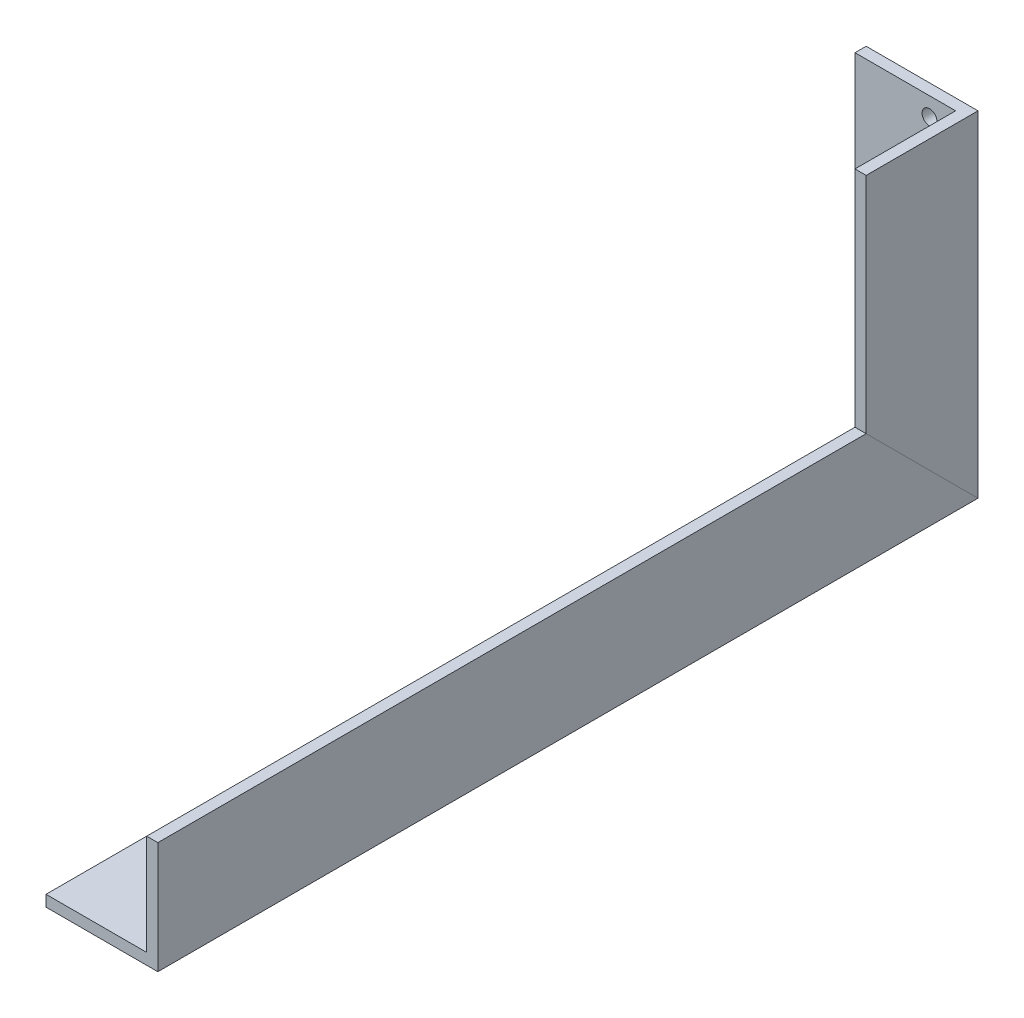
ISO-10303-21;
HEADER;
FILE_DESCRIPTION(('STEP AP214'),'2;1');
FILE_NAME('part.step','',(''),(''),'','','');
FILE_SCHEMA(('AUTOMOTIVE_DESIGN { 1 0 10303 214 1 1 1 1 }'));
ENDSEC;
DATA;
#1=APPLICATION_CONTEXT('core data for automotive mechanical design processes');
#2=APPLICATION_PROTOCOL_DEFINITION('international standard','automotive_design',2000,#1);
#3=PRODUCT_CONTEXT('',#1,'mechanical');
#4=PRODUCT('Part','Part','',(#3));
#5=PRODUCT_RELATED_PRODUCT_CATEGORY('part','',(#4));
#6=PRODUCT_DEFINITION_FORMATION('','',#4);
#7=PRODUCT_DEFINITION_CONTEXT('part definition',#1,'design');
#8=PRODUCT_DEFINITION('design','',#6,#7);
#9=PRODUCT_DEFINITION_SHAPE('','',#8);
#10=(LENGTH_UNIT() NAMED_UNIT(*) SI_UNIT(.MILLI.,.METRE.));
#11=(NAMED_UNIT(*) PLANE_ANGLE_UNIT() SI_UNIT($,.RADIAN.));
#12=(NAMED_UNIT(*) SI_UNIT($,.STERADIAN.) SOLID_ANGLE_UNIT());
#13=UNCERTAINTY_MEASURE_WITH_UNIT(LENGTH_MEASURE(1.E-05),#10,'distance_accuracy_value','');
#14=(GEOMETRIC_REPRESENTATION_CONTEXT(3) GLOBAL_UNCERTAINTY_ASSIGNED_CONTEXT((#13)) GLOBAL_UNIT_ASSIGNED_CONTEXT((#10,
#11,#12)) REPRESENTATION_CONTEXT('',''));
#15=CARTESIAN_POINT('',(0.,0.,0.));
#16=DIRECTION('',(0.,0.,1.));
#17=DIRECTION('',(1.,0.,0.));
#18=AXIS2_PLACEMENT_3D('',#15,#16,#17);
#19=CARTESIAN_POINT('',(0.,90.,-220.));
#20=DIRECTION('',(0.,-1.,0.));
#21=DIRECTION('',(1.,0.,0.));
#22=AXIS2_PLACEMENT_3D('',#19,#20,#21);
#23=PLANE('',#22);
#24=DIRECTION('',(0.,0.,-1.));
#25=VECTOR('',#24,1.);
#26=CARTESIAN_POINT('',(0.,90.,-217.));
#27=LINE('',#26,#25);
#28=CARTESIAN_POINT('',(0.,90.,-217.));
#29=VERTEX_POINT('',#28);
#30=CARTESIAN_POINT('',(0.,90.,-220.));
#31=VERTEX_POINT('',#30);
#32=EDGE_CURVE('E79',#29,#31,#27,.T.);
#33=ORIENTED_EDGE('',*,*,#32,.F.);
#34=DIRECTION('',(-1.,0.,0.));
#35=VECTOR('',#34,1.);
#36=CARTESIAN_POINT('',(27.,90.,-217.));
#37=LINE('',#36,#35);
#38=CARTESIAN_POINT('',(27.,90.,-217.));
#39=VERTEX_POINT('',#38);
#40=EDGE_CURVE('E87',#39,#29,#37,.T.);
#41=ORIENTED_EDGE('',*,*,#40,.F.);
#42=DIRECTION('',(0.,0.,-1.));
#43=VECTOR('',#42,1.);
#44=CARTESIAN_POINT('',(27.,90.,-190.));
#45=LINE('',#44,#43);
#46=CARTESIAN_POINT('',(27.,90.,-190.));
#47=VERTEX_POINT('',#46);
#48=EDGE_CURVE('E188',#47,#39,#45,.T.);
#49=ORIENTED_EDGE('',*,*,#48,.F.);
#50=DIRECTION('',(-1.,0.,0.));
#51=VECTOR('',#50,1.);
#52=CARTESIAN_POINT('',(30.,90.,-190.));
#53=LINE('',#52,#51);
#54=CARTESIAN_POINT('',(30.,90.,-190.));
#55=VERTEX_POINT('',#54);
#56=EDGE_CURVE('E192',#55,#47,#53,.T.);
#57=ORIENTED_EDGE('',*,*,#56,.F.);
#58=DIRECTION('',(0.,0.,1.));
#59=VECTOR('',#58,1.);
#60=CARTESIAN_POINT('',(30.,90.,-220.));
#61=LINE('',#60,#59);
#62=CARTESIAN_POINT('',(30.,90.,-220.));
#63=VERTEX_POINT('',#62);
#64=EDGE_CURVE('E196',#63,#55,#61,.T.);
#65=ORIENTED_EDGE('',*,*,#64,.F.);
#66=DIRECTION('',(1.,0.,0.));
#67=VECTOR('',#66,1.);
#68=CARTESIAN_POINT('',(0.,90.,-220.));
#69=LINE('',#68,#67);
#70=EDGE_CURVE('E203',#31,#63,#69,.T.);
#71=ORIENTED_EDGE('',*,*,#70,.F.);
#72=EDGE_LOOP('',(#33,#41,#49,#57,#65,#71));
#73=FACE_BOUND('',#72,.T.);
#74=ADVANCED_FACE('F38',(#73),#23,.F.);
#75=CARTESIAN_POINT('',(0.,0.,0.));
#76=DIRECTION('',(0.,0.,1.));
#77=DIRECTION('',(1.,0.,0.));
#78=AXIS2_PLACEMENT_3D('',#75,#76,#77);
#79=PLANE('',#78);
#80=DIRECTION('',(0.,-1.,0.));
#81=VECTOR('',#80,1.);
#82=CARTESIAN_POINT('',(0.,3.,0.));
#83=LINE('',#82,#81);
#84=CARTESIAN_POINT('',(0.,3.,0.));
#85=VERTEX_POINT('',#84);
#86=CARTESIAN_POINT('',(0.,0.,0.));
#87=VERTEX_POINT('',#86);
#88=EDGE_CURVE('E11',#85,#87,#83,.T.);
#89=ORIENTED_EDGE('',*,*,#88,.T.);
#90=DIRECTION('',(1.,0.,0.));
#91=VECTOR('',#90,1.);
#92=CARTESIAN_POINT('',(0.,0.,0.));
#93=LINE('',#92,#91);
#94=CARTESIAN_POINT('',(30.,0.,0.));
#95=VERTEX_POINT('',#94);
#96=EDGE_CURVE('E48',#87,#95,#93,.T.);
#97=ORIENTED_EDGE('',*,*,#96,.T.);
#98=DIRECTION('',(0.,1.,0.));
#99=VECTOR('',#98,1.);
#100=CARTESIAN_POINT('',(30.,0.,0.));
#101=LINE('',#100,#99);
#102=CARTESIAN_POINT('',(30.,30.,0.));
#103=VERTEX_POINT('',#102);
#104=EDGE_CURVE('E122',#95,#103,#101,.T.);
#105=ORIENTED_EDGE('',*,*,#104,.T.);
#106=DIRECTION('',(-1.,0.,0.));
#107=VECTOR('',#106,1.);
#108=CARTESIAN_POINT('',(30.,30.,0.));
#109=LINE('',#108,#107);
#110=CARTESIAN_POINT('',(27.,30.,0.));
#111=VERTEX_POINT('',#110);
#112=EDGE_CURVE('E132',#103,#111,#109,.T.);
#113=ORIENTED_EDGE('',*,*,#112,.T.);
#114=DIRECTION('',(0.,-1.,0.));
#115=VECTOR('',#114,1.);
#116=CARTESIAN_POINT('',(27.,30.,0.));
#117=LINE('',#116,#115);
#118=CARTESIAN_POINT('',(27.,3.,0.));
#119=VERTEX_POINT('',#118);
#120=EDGE_CURVE('E230',#111,#119,#117,.T.);
#121=ORIENTED_EDGE('',*,*,#120,.T.);
#122=DIRECTION('',(-1.,0.,0.));
#123=VECTOR('',#122,1.);
#124=CARTESIAN_POINT('',(27.,3.,0.));
#125=LINE('',#124,#123);
#126=EDGE_CURVE('E184',#119,#85,#125,.T.);
#127=ORIENTED_EDGE('',*,*,#126,.T.);
#128=EDGE_LOOP('',(#89,#97,#105,#113,#121,#127));
#129=FACE_BOUND('',#128,.T.);
#130=ADVANCED_FACE('F134',(#129),#79,.T.);
#131=CARTESIAN_POINT('',(0.,0.,-217.));
#132=DIRECTION('',(1.,0.,0.));
#133=DIRECTION('',(0.,0.,-1.));
#134=AXIS2_PLACEMENT_3D('',#131,#132,#133);
#135=PLANE('',#134);
#136=DIRECTION('',(0.,0.707106781186548,0.707106781186548));
#137=VECTOR('',#136,1.);
#138=CARTESIAN_POINT('',(0.,111.5,-108.5));
#139=LINE('',#138,#137);
#140=CARTESIAN_POINT('',(0.,0.,-220.));
#141=VERTEX_POINT('',#140);
#142=CARTESIAN_POINT('',(0.,3.00000000000001,-217.));
#143=VERTEX_POINT('',#142);
#144=EDGE_CURVE('E160',#141,#143,#139,.T.);
#145=ORIENTED_EDGE('',*,*,#144,.T.);
#146=DIRECTION('',(0.,1.,0.));
#147=VECTOR('',#146,1.);
#148=CARTESIAN_POINT('',(0.,0.,-217.));
#149=LINE('',#148,#147);
#150=EDGE_CURVE('E171',#143,#29,#149,.T.);
#151=ORIENTED_EDGE('',*,*,#150,.T.);
#152=ORIENTED_EDGE('',*,*,#32,.T.);
#153=DIRECTION('',(0.,1.,0.));
#154=VECTOR('',#153,1.);
#155=CARTESIAN_POINT('',(0.,0.,-220.));
#156=LINE('',#155,#154);
#157=EDGE_CURVE('E206',#141,#31,#156,.T.);
#158=ORIENTED_EDGE('',*,*,#157,.F.);
#159=EDGE_LOOP('',(#145,#151,#152,#158));
#160=FACE_BOUND('',#159,.T.);
#161=ADVANCED_FACE('F220',(#160),#135,.F.);
#162=CARTESIAN_POINT('',(0.,0.,-220.));
#163=DIRECTION('',(0.,0.,1.));
#164=DIRECTION('',(1.,0.,0.));
#165=AXIS2_PLACEMENT_3D('',#162,#163,#164);
#166=PLANE('',#165);
#167=CARTESIAN_POINT('',(20.0000000000113,84.9999999999405,-220.));
#168=DIRECTION('',(0.,0.,-1.));
#169=DIRECTION('',(-1.,0.,0.));
#170=AXIS2_PLACEMENT_3D('',#167,#168,#169);
#171=CIRCLE('',#170,2.);
#172=CARTESIAN_POINT('',(18.0000000000113,84.9999999999405,-220.));
#173=VERTEX_POINT('',#172);
#174=EDGE_CURVE('E376',#173,#173,#171,.T.);
#175=ORIENTED_EDGE('',*,*,#174,.F.);
#176=EDGE_LOOP('',(#175));
#177=FACE_BOUND('',#176,.T.);
#178=DIRECTION('',(0.,1.,0.));
#179=VECTOR('',#178,1.);
#180=CARTESIAN_POINT('',(30.,0.,-220.));
#181=LINE('',#180,#179);
#182=CARTESIAN_POINT('',(30.,0.,-220.));
#183=VERTEX_POINT('',#182);
#184=EDGE_CURVE('E199',#183,#63,#181,.T.);
#185=ORIENTED_EDGE('',*,*,#184,.F.);
#186=DIRECTION('',(1.,0.,0.));
#187=VECTOR('',#186,1.);
#188=CARTESIAN_POINT('',(0.,0.,-220.));
#189=LINE('',#188,#187);
#190=EDGE_CURVE('E141',#141,#183,#189,.T.);
#191=ORIENTED_EDGE('',*,*,#190,.F.);
#192=ORIENTED_EDGE('',*,*,#157,.T.);
#193=ORIENTED_EDGE('',*,*,#70,.T.);
#194=EDGE_LOOP('',(#185,#191,#192,#193));
#195=FACE_BOUND('',#194,.T.);
#196=ADVANCED_FACE('F240',(#177,#195),#166,.F.);
#197=CARTESIAN_POINT('',(30.,0.,-220.));
#198=DIRECTION('',(-1.,0.,0.));
#199=DIRECTION('',(0.,0.,1.));
#200=AXIS2_PLACEMENT_3D('',#197,#198,#199);
#201=PLANE('',#200);
#202=DIRECTION('',(0.,-0.707106781186548,-0.707106781186548));
#203=VECTOR('',#202,1.);
#204=CARTESIAN_POINT('',(30.,110.,-110.));
#205=LINE('',#204,#203);
#206=CARTESIAN_POINT('',(30.,30.,-190.));
#207=VERTEX_POINT('',#206);
#208=EDGE_CURVE('E95',#207,#183,#205,.T.);
#209=ORIENTED_EDGE('',*,*,#208,.T.);
#210=ORIENTED_EDGE('',*,*,#184,.T.);
#211=ORIENTED_EDGE('',*,*,#64,.T.);
#212=DIRECTION('',(0.,1.,0.));
#213=VECTOR('',#212,1.);
#214=CARTESIAN_POINT('',(30.,0.,-190.));
#215=LINE('',#214,#213);
#216=EDGE_CURVE('E195',#207,#55,#215,.T.);
#217=ORIENTED_EDGE('',*,*,#216,.F.);
#218=EDGE_LOOP('',(#209,#210,#211,#217));
#219=FACE_BOUND('',#218,.T.);
#220=ADVANCED_FACE('F264',(#219),#201,.F.);
#221=CARTESIAN_POINT('',(30.,0.,-190.));
#222=DIRECTION('',(0.,0.,-1.));
#223=DIRECTION('',(-1.,0.,0.));
#224=AXIS2_PLACEMENT_3D('',#221,#222,#223);
#225=PLANE('',#224);
#226=DIRECTION('',(1.,0.,0.));
#227=VECTOR('',#226,1.);
#228=CARTESIAN_POINT('',(30.,30.,-190.));
#229=LINE('',#228,#227);
#230=CARTESIAN_POINT('',(27.,30.,-190.));
#231=VERTEX_POINT('',#230);
#232=EDGE_CURVE('E165',#231,#207,#229,.T.);
#233=ORIENTED_EDGE('',*,*,#232,.T.);
#234=ORIENTED_EDGE('',*,*,#216,.T.);
#235=ORIENTED_EDGE('',*,*,#56,.T.);
#236=DIRECTION('',(0.,1.,0.));
#237=VECTOR('',#236,1.);
#238=CARTESIAN_POINT('',(27.,0.,-190.));
#239=LINE('',#238,#237);
#240=EDGE_CURVE('E191',#231,#47,#239,.T.);
#241=ORIENTED_EDGE('',*,*,#240,.F.);
#242=EDGE_LOOP('',(#233,#234,#235,#241));
#243=FACE_BOUND('',#242,.T.);
#244=ADVANCED_FACE('F268',(#243),#225,.F.);
#245=CARTESIAN_POINT('',(27.,0.,-190.));
#246=DIRECTION('',(1.,0.,0.));
#247=DIRECTION('',(0.,0.,-1.));
#248=AXIS2_PLACEMENT_3D('',#245,#246,#247);
#249=PLANE('',#248);
#250=DIRECTION('',(0.,0.707106781186548,0.707106781186548));
#251=VECTOR('',#250,1.);
#252=CARTESIAN_POINT('',(27.,125.,-95.));
#253=LINE('',#252,#251);
#254=CARTESIAN_POINT('',(27.,3.00000000000002,-217.));
#255=VERTEX_POINT('',#254);
#256=EDGE_CURVE('E161',#255,#231,#253,.T.);
#257=ORIENTED_EDGE('',*,*,#256,.T.);
#258=ORIENTED_EDGE('',*,*,#240,.T.);
#259=ORIENTED_EDGE('',*,*,#48,.T.);
#260=DIRECTION('',(0.,1.,0.));
#261=VECTOR('',#260,1.);
#262=CARTESIAN_POINT('',(27.,0.,-217.));
#263=LINE('',#262,#261);
#264=EDGE_CURVE('E187',#255,#39,#263,.T.);
#265=ORIENTED_EDGE('',*,*,#264,.F.);
#266=EDGE_LOOP('',(#257,#258,#259,#265));
#267=FACE_BOUND('',#266,.T.);
#268=ADVANCED_FACE('F233',(#267),#249,.F.);
#269=CARTESIAN_POINT('',(27.,0.,-217.));
#270=DIRECTION('',(0.,0.,-1.));
#271=DIRECTION('',(-1.,0.,0.));
#272=AXIS2_PLACEMENT_3D('',#269,#270,#271);
#273=PLANE('',#272);
#274=CARTESIAN_POINT('',(20.0000000000113,84.9999999999405,-217.));
#275=DIRECTION('',(0.,0.,-1.));
#276=DIRECTION('',(-1.,0.,0.));
#277=AXIS2_PLACEMENT_3D('',#274,#275,#276);
#278=CIRCLE('',#277,2.);
#279=CARTESIAN_POINT('',(18.0000000000113,84.9999999999405,-217.));
#280=VERTEX_POINT('',#279);
#281=EDGE_CURVE('E41',#280,#280,#278,.T.);
#282=ORIENTED_EDGE('',*,*,#281,.T.);
#283=EDGE_LOOP('',(#282));
#284=FACE_BOUND('',#283,.T.);
#285=DIRECTION('',(1.,0.,0.));
#286=VECTOR('',#285,1.);
#287=CARTESIAN_POINT('',(27.,3.,-217.));
#288=LINE('',#287,#286);
#289=EDGE_CURVE('E156',#143,#255,#288,.T.);
#290=ORIENTED_EDGE('',*,*,#289,.T.);
#291=ORIENTED_EDGE('',*,*,#264,.T.);
#292=ORIENTED_EDGE('',*,*,#40,.T.);
#293=ORIENTED_EDGE('',*,*,#150,.F.);
#294=EDGE_LOOP('',(#290,#291,#292,#293));
#295=FACE_BOUND('',#294,.T.);
#296=ADVANCED_FACE('F221',(#284,#295),#273,.F.);
#297=CARTESIAN_POINT('',(0.,0.,0.));
#298=DIRECTION('',(0.,1.,0.));
#299=DIRECTION('',(0.,0.,1.));
#300=AXIS2_PLACEMENT_3D('',#297,#298,#299);
#301=PLANE('',#300);
#302=DIRECTION('',(0.,0.,-1.));
#303=VECTOR('',#302,1.);
#304=CARTESIAN_POINT('',(30.,0.,0.));
#305=LINE('',#304,#303);
#306=EDGE_CURVE('E126',#95,#183,#305,.T.);
#307=ORIENTED_EDGE('',*,*,#306,.F.);
#308=ORIENTED_EDGE('',*,*,#96,.F.);
#309=DIRECTION('',(0.,0.,-1.));
#310=VECTOR('',#309,1.);
#311=CARTESIAN_POINT('',(0.,0.,0.));
#312=LINE('',#311,#310);
#313=EDGE_CURVE('E147',#87,#141,#312,.T.);
#314=ORIENTED_EDGE('',*,*,#313,.T.);
#315=ORIENTED_EDGE('',*,*,#190,.T.);
#316=EDGE_LOOP('',(#307,#308,#314,#315));
#317=FACE_BOUND('',#316,.T.);
#318=ADVANCED_FACE('F139',(#317),#301,.F.);
#319=CARTESIAN_POINT('',(0.,3.,0.));
#320=DIRECTION('',(1.,0.,0.));
#321=DIRECTION('',(0.,1.,0.));
#322=AXIS2_PLACEMENT_3D('',#319,#320,#321);
#323=PLANE('',#322);
#324=ORIENTED_EDGE('',*,*,#313,.F.);
#325=ORIENTED_EDGE('',*,*,#88,.F.);
#326=DIRECTION('',(0.,0.,-1.));
#327=VECTOR('',#326,1.);
#328=CARTESIAN_POINT('',(0.,3.,0.));
#329=LINE('',#328,#327);
#330=EDGE_CURVE('E154',#85,#143,#329,.T.);
#331=ORIENTED_EDGE('',*,*,#330,.T.);
#332=ORIENTED_EDGE('',*,*,#144,.F.);
#333=EDGE_LOOP('',(#324,#325,#331,#332));
#334=FACE_BOUND('',#333,.T.);
#335=ADVANCED_FACE('F241',(#334),#323,.F.);
#336=CARTESIAN_POINT('',(30.,0.,0.));
#337=DIRECTION('',(-1.,0.,0.));
#338=DIRECTION('',(0.,0.,1.));
#339=AXIS2_PLACEMENT_3D('',#336,#337,#338);
#340=PLANE('',#339);
#341=DIRECTION('',(0.,0.,-1.));
#342=VECTOR('',#341,1.);
#343=CARTESIAN_POINT('',(30.,30.,0.));
#344=LINE('',#343,#342);
#345=EDGE_CURVE('E128',#103,#207,#344,.T.);
#346=ORIENTED_EDGE('',*,*,#345,.F.);
#347=ORIENTED_EDGE('',*,*,#104,.F.);
#348=ORIENTED_EDGE('',*,*,#306,.T.);
#349=ORIENTED_EDGE('',*,*,#208,.F.);
#350=EDGE_LOOP('',(#346,#347,#348,#349));
#351=FACE_BOUND('',#350,.T.);
#352=ADVANCED_FACE('F124',(#351),#340,.F.);
#353=CARTESIAN_POINT('',(30.,30.,0.));
#354=DIRECTION('',(0.,-1.,0.));
#355=DIRECTION('',(0.,0.,-1.));
#356=AXIS2_PLACEMENT_3D('',#353,#354,#355);
#357=PLANE('',#356);
#358=DIRECTION('',(0.,0.,-1.));
#359=VECTOR('',#358,1.);
#360=CARTESIAN_POINT('',(27.,30.,0.));
#361=LINE('',#360,#359);
#362=EDGE_CURVE('E149',#111,#231,#361,.T.);
#363=ORIENTED_EDGE('',*,*,#362,.F.);
#364=ORIENTED_EDGE('',*,*,#112,.F.);
#365=ORIENTED_EDGE('',*,*,#345,.T.);
#366=ORIENTED_EDGE('',*,*,#232,.F.);
#367=EDGE_LOOP('',(#363,#364,#365,#366));
#368=FACE_BOUND('',#367,.T.);
#369=ADVANCED_FACE('F248',(#368),#357,.F.);
#370=CARTESIAN_POINT('',(27.,30.,0.));
#371=DIRECTION('',(1.,0.,0.));
#372=DIRECTION('',(0.,1.,0.));
#373=AXIS2_PLACEMENT_3D('',#370,#371,#372);
#374=PLANE('',#373);
#375=DIRECTION('',(0.,0.,-1.));
#376=VECTOR('',#375,1.);
#377=CARTESIAN_POINT('',(27.,3.,0.));
#378=LINE('',#377,#376);
#379=EDGE_CURVE('E175',#119,#255,#378,.T.);
#380=ORIENTED_EDGE('',*,*,#379,.F.);
#381=ORIENTED_EDGE('',*,*,#120,.F.);
#382=ORIENTED_EDGE('',*,*,#362,.T.);
#383=ORIENTED_EDGE('',*,*,#256,.F.);
#384=EDGE_LOOP('',(#380,#381,#382,#383));
#385=FACE_BOUND('',#384,.T.);
#386=ADVANCED_FACE('F229',(#385),#374,.F.);
#387=CARTESIAN_POINT('',(27.,3.,0.));
#388=DIRECTION('',(0.,-1.,0.));
#389=DIRECTION('',(1.,0.,0.));
#390=AXIS2_PLACEMENT_3D('',#387,#388,#389);
#391=PLANE('',#390);
#392=ORIENTED_EDGE('',*,*,#330,.F.);
#393=ORIENTED_EDGE('',*,*,#126,.F.);
#394=ORIENTED_EDGE('',*,*,#379,.T.);
#395=ORIENTED_EDGE('',*,*,#289,.F.);
#396=EDGE_LOOP('',(#392,#393,#394,#395));
#397=FACE_BOUND('',#396,.T.);
#398=ADVANCED_FACE('F226',(#397),#391,.F.);
#399=CARTESIAN_POINT('',(20.0000000000113,84.9999999999405,-210.));
#400=DIRECTION('',(0.,0.,-1.));
#401=DIRECTION('',(-1.,0.,0.));
#402=AXIS2_PLACEMENT_3D('',#399,#400,#401);
#403=CYLINDRICAL_SURFACE('',#402,2.);
#404=ORIENTED_EDGE('',*,*,#174,.T.);
#405=EDGE_LOOP('',(#404));
#406=FACE_BOUND('',#405,.T.);
#407=ORIENTED_EDGE('',*,*,#281,.F.);
#408=EDGE_LOOP('',(#407));
#409=FACE_BOUND('',#408,.T.);
#410=ADVANCED_FACE('F254',(#406,#409),#403,.F.);
#411=CLOSED_SHELL('',(#74,#130,#161,#196,#220,#244,#268,#296,#318,#335,#352,#369,#386,#398,#410));
#412=MANIFOLD_SOLID_BREP('B2',#411);
#413=ADVANCED_BREP_SHAPE_REPRESENTATION('',(#18,#412),#14);
#414=SHAPE_DEFINITION_REPRESENTATION(#9,#413);
ENDSEC;
END-ISO-10303-21;
